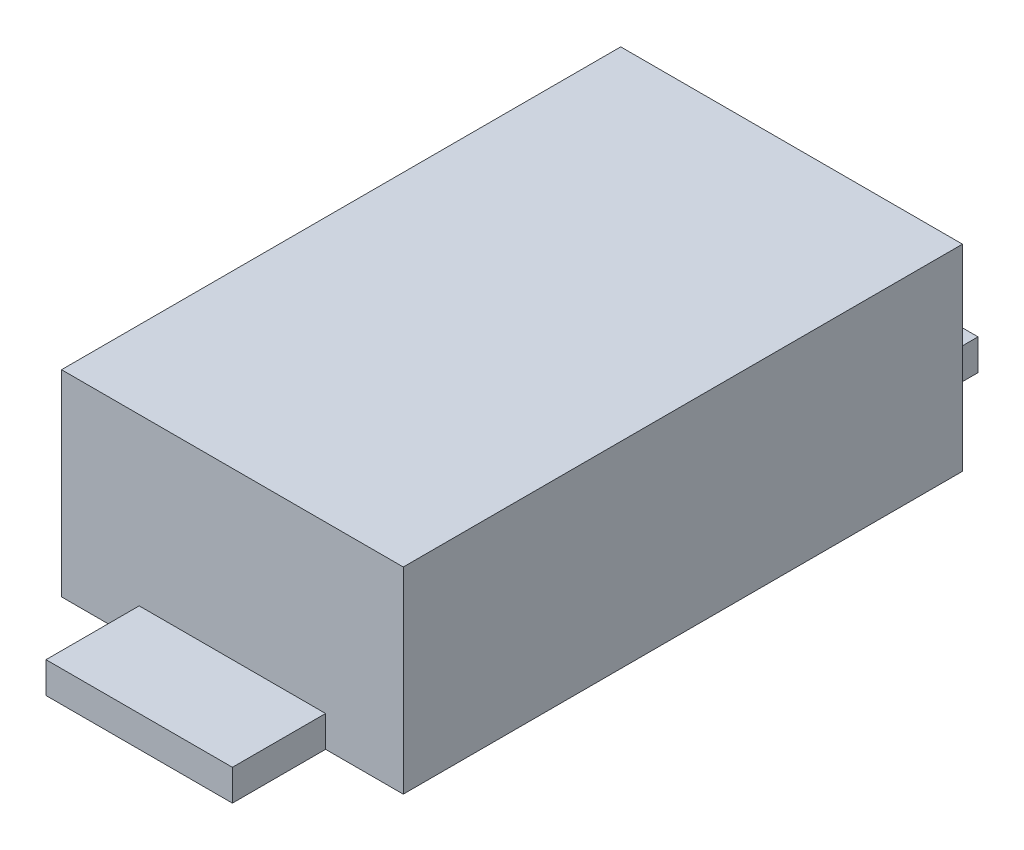
ISO-10303-21;
HEADER;
FILE_DESCRIPTION(('STEP AP214'),'2;1');
FILE_NAME('part.step','',(''),(''),'','','');
FILE_SCHEMA(('AUTOMOTIVE_DESIGN { 1 0 10303 214 1 1 1 1 }'));
ENDSEC;
DATA;
#1=APPLICATION_CONTEXT('core data for automotive mechanical design processes');
#2=APPLICATION_PROTOCOL_DEFINITION('international standard','automotive_design',2000,#1);
#3=PRODUCT_CONTEXT('',#1,'mechanical');
#4=PRODUCT('Part','Part','',(#3));
#5=PRODUCT_RELATED_PRODUCT_CATEGORY('part','',(#4));
#6=PRODUCT_DEFINITION_FORMATION('','',#4);
#7=PRODUCT_DEFINITION_CONTEXT('part definition',#1,'design');
#8=PRODUCT_DEFINITION('design','',#6,#7);
#9=PRODUCT_DEFINITION_SHAPE('','',#8);
#10=(LENGTH_UNIT() NAMED_UNIT(*) SI_UNIT(.MILLI.,.METRE.));
#11=(NAMED_UNIT(*) PLANE_ANGLE_UNIT() SI_UNIT($,.RADIAN.));
#12=(NAMED_UNIT(*) SI_UNIT($,.STERADIAN.) SOLID_ANGLE_UNIT());
#13=UNCERTAINTY_MEASURE_WITH_UNIT(LENGTH_MEASURE(1.E-05),#10,'distance_accuracy_value','');
#14=(GEOMETRIC_REPRESENTATION_CONTEXT(3) GLOBAL_UNCERTAINTY_ASSIGNED_CONTEXT((#13)) GLOBAL_UNIT_ASSIGNED_CONTEXT((#10,
#11,#12)) REPRESENTATION_CONTEXT('',''));
#15=CARTESIAN_POINT('',(0.,0.,0.));
#16=DIRECTION('',(0.,0.,1.));
#17=DIRECTION('',(1.,0.,0.));
#18=AXIS2_PLACEMENT_3D('',#15,#16,#17);
#19=CARTESIAN_POINT('',(0.,0.15,0.));
#20=DIRECTION('',(0.,-1.,0.));
#21=DIRECTION('',(0.,0.,-1.));
#22=AXIS2_PLACEMENT_3D('',#19,#20,#21);
#23=PLANE('',#22);
#24=DIRECTION('',(0.,0.,-1.));
#25=VECTOR('',#24,1.);
#26=CARTESIAN_POINT('',(-0.45,0.15,1.35));
#27=LINE('',#26,#25);
#28=CARTESIAN_POINT('',(-0.45,0.15,1.8));
#29=VERTEX_POINT('',#28);
#30=CARTESIAN_POINT('',(-0.45,0.15,1.35));
#31=VERTEX_POINT('',#30);
#32=EDGE_CURVE('E204',#29,#31,#27,.T.);
#33=ORIENTED_EDGE('',*,*,#32,.F.);
#34=DIRECTION('',(-1.,0.,0.));
#35=VECTOR('',#34,1.);
#36=CARTESIAN_POINT('',(-0.45,0.15,1.8));
#37=LINE('',#36,#35);
#38=CARTESIAN_POINT('',(0.45,0.15,1.8));
#39=VERTEX_POINT('',#38);
#40=EDGE_CURVE('E25',#39,#29,#37,.T.);
#41=ORIENTED_EDGE('',*,*,#40,.F.);
#42=DIRECTION('',(0.,0.,1.));
#43=VECTOR('',#42,1.);
#44=CARTESIAN_POINT('',(0.45,0.15,1.35));
#45=LINE('',#44,#43);
#46=CARTESIAN_POINT('',(0.45,0.15,1.35));
#47=VERTEX_POINT('',#46);
#48=EDGE_CURVE('E11',#47,#39,#45,.T.);
#49=ORIENTED_EDGE('',*,*,#48,.F.);
#50=DIRECTION('',(1.,0.,0.));
#51=VECTOR('',#50,1.);
#52=CARTESIAN_POINT('',(-0.45,0.15,1.35));
#53=LINE('',#52,#51);
#54=EDGE_CURVE('E165',#31,#47,#53,.T.);
#55=ORIENTED_EDGE('',*,*,#54,.F.);
#56=EDGE_LOOP('',(#33,#41,#49,#55));
#57=FACE_BOUND('',#56,.T.);
#58=ADVANCED_FACE('F17',(#57),#23,.F.);
#59=CARTESIAN_POINT('',(0.45,0.15,1.35));
#60=DIRECTION('',(1.,0.,0.));
#61=DIRECTION('',(0.,1.,0.));
#62=AXIS2_PLACEMENT_3D('',#59,#60,#61);
#63=PLANE('',#62);
#64=DIRECTION('',(0.,0.,1.));
#65=VECTOR('',#64,1.);
#66=CARTESIAN_POINT('',(0.45,0.,1.35));
#67=LINE('',#66,#65);
#68=CARTESIAN_POINT('',(0.45,0.,1.35));
#69=VERTEX_POINT('',#68);
#70=CARTESIAN_POINT('',(0.45,0.,1.8));
#71=VERTEX_POINT('',#70);
#72=EDGE_CURVE('E187',#69,#71,#67,.T.);
#73=ORIENTED_EDGE('',*,*,#72,.F.);
#74=DIRECTION('',(0.,-1.,0.));
#75=VECTOR('',#74,1.);
#76=CARTESIAN_POINT('',(0.45,0.15,1.35));
#77=LINE('',#76,#75);
#78=EDGE_CURVE('E160',#47,#69,#77,.T.);
#79=ORIENTED_EDGE('',*,*,#78,.F.);
#80=ORIENTED_EDGE('',*,*,#48,.T.);
#81=DIRECTION('',(0.,-1.,0.));
#82=VECTOR('',#81,1.);
#83=CARTESIAN_POINT('',(0.45,0.15,1.8));
#84=LINE('',#83,#82);
#85=EDGE_CURVE('E206',#39,#71,#84,.T.);
#86=ORIENTED_EDGE('',*,*,#85,.T.);
#87=EDGE_LOOP('',(#73,#79,#80,#86));
#88=FACE_BOUND('',#87,.T.);
#89=ADVANCED_FACE('F264',(#88),#63,.T.);
#90=CARTESIAN_POINT('',(-0.45,0.15,1.8));
#91=DIRECTION('',(0.,0.,1.));
#92=DIRECTION('',(1.,0.,0.));
#93=AXIS2_PLACEMENT_3D('',#90,#91,#92);
#94=PLANE('',#93);
#95=DIRECTION('',(-1.,0.,0.));
#96=VECTOR('',#95,1.);
#97=CARTESIAN_POINT('',(-0.45,0.,1.8));
#98=LINE('',#97,#96);
#99=CARTESIAN_POINT('',(-0.45,0.,1.8));
#100=VERTEX_POINT('',#99);
#101=EDGE_CURVE('E182',#71,#100,#98,.T.);
#102=ORIENTED_EDGE('',*,*,#101,.F.);
#103=ORIENTED_EDGE('',*,*,#85,.F.);
#104=ORIENTED_EDGE('',*,*,#40,.T.);
#105=DIRECTION('',(0.,-1.,0.));
#106=VECTOR('',#105,1.);
#107=CARTESIAN_POINT('',(-0.45,0.15,1.8));
#108=LINE('',#107,#106);
#109=EDGE_CURVE('E207',#29,#100,#108,.T.);
#110=ORIENTED_EDGE('',*,*,#109,.T.);
#111=EDGE_LOOP('',(#102,#103,#104,#110));
#112=FACE_BOUND('',#111,.T.);
#113=ADVANCED_FACE('F258',(#112),#94,.T.);
#114=CARTESIAN_POINT('',(-0.45,0.15,1.35));
#115=DIRECTION('',(-1.,0.,0.));
#116=DIRECTION('',(0.,0.,1.));
#117=AXIS2_PLACEMENT_3D('',#114,#115,#116);
#118=PLANE('',#117);
#119=DIRECTION('',(0.,0.,-1.));
#120=VECTOR('',#119,1.);
#121=CARTESIAN_POINT('',(-0.45,0.,1.35));
#122=LINE('',#121,#120);
#123=CARTESIAN_POINT('',(-0.45,0.,1.35));
#124=VERTEX_POINT('',#123);
#125=EDGE_CURVE('E186',#100,#124,#122,.T.);
#126=ORIENTED_EDGE('',*,*,#125,.F.);
#127=ORIENTED_EDGE('',*,*,#109,.F.);
#128=ORIENTED_EDGE('',*,*,#32,.T.);
#129=DIRECTION('',(0.,-1.,0.));
#130=VECTOR('',#129,1.);
#131=CARTESIAN_POINT('',(-0.45,0.15,1.35));
#132=LINE('',#131,#130);
#133=EDGE_CURVE('E491',#31,#124,#132,.T.);
#134=ORIENTED_EDGE('',*,*,#133,.T.);
#135=EDGE_LOOP('',(#126,#127,#128,#134));
#136=FACE_BOUND('',#135,.T.);
#137=ADVANCED_FACE('F263',(#136),#118,.T.);
#138=CARTESIAN_POINT('',(0.,0.15,0.));
#139=DIRECTION('',(0.,-1.,0.));
#140=DIRECTION('',(0.,0.,-1.));
#141=AXIS2_PLACEMENT_3D('',#138,#139,#140);
#142=PLANE('',#141);
#143=DIRECTION('',(0.,0.,1.));
#144=VECTOR('',#143,1.);
#145=CARTESIAN_POINT('',(-0.45,0.15,-1.35));
#146=LINE('',#145,#144);
#147=CARTESIAN_POINT('',(-0.45,0.15,-1.8));
#148=VERTEX_POINT('',#147);
#149=CARTESIAN_POINT('',(-0.45,0.15,-1.35));
#150=VERTEX_POINT('',#149);
#151=EDGE_CURVE('E235',#148,#150,#146,.T.);
#152=ORIENTED_EDGE('',*,*,#151,.T.);
#153=DIRECTION('',(1.,0.,0.));
#154=VECTOR('',#153,1.);
#155=CARTESIAN_POINT('',(-0.45,0.15,-1.35));
#156=LINE('',#155,#154);
#157=CARTESIAN_POINT('',(0.45,0.15,-1.35));
#158=VERTEX_POINT('',#157);
#159=EDGE_CURVE('E178',#150,#158,#156,.T.);
#160=ORIENTED_EDGE('',*,*,#159,.T.);
#161=DIRECTION('',(0.,0.,-1.));
#162=VECTOR('',#161,1.);
#163=CARTESIAN_POINT('',(0.45,0.15,-1.35));
#164=LINE('',#163,#162);
#165=CARTESIAN_POINT('',(0.45,0.15,-1.8));
#166=VERTEX_POINT('',#165);
#167=EDGE_CURVE('E239',#158,#166,#164,.T.);
#168=ORIENTED_EDGE('',*,*,#167,.T.);
#169=DIRECTION('',(-1.,0.,0.));
#170=VECTOR('',#169,1.);
#171=CARTESIAN_POINT('',(-0.45,0.15,-1.8));
#172=LINE('',#171,#170);
#173=EDGE_CURVE('E219',#166,#148,#172,.T.);
#174=ORIENTED_EDGE('',*,*,#173,.T.);
#175=EDGE_LOOP('',(#152,#160,#168,#174));
#176=FACE_BOUND('',#175,.T.);
#177=ADVANCED_FACE('F306',(#176),#142,.F.);
#178=CARTESIAN_POINT('',(-0.45,0.15,-1.8));
#179=DIRECTION('',(0.,0.,1.));
#180=DIRECTION('',(1.,0.,0.));
#181=AXIS2_PLACEMENT_3D('',#178,#179,#180);
#182=PLANE('',#181);
#183=DIRECTION('',(-1.,0.,0.));
#184=VECTOR('',#183,1.);
#185=CARTESIAN_POINT('',(-0.45,0.,-1.8));
#186=LINE('',#185,#184);
#187=CARTESIAN_POINT('',(0.45,0.,-1.8));
#188=VERTEX_POINT('',#187);
#189=CARTESIAN_POINT('',(-0.45,0.,-1.8));
#190=VERTEX_POINT('',#189);
#191=EDGE_CURVE('E227',#188,#190,#186,.T.);
#192=ORIENTED_EDGE('',*,*,#191,.T.);
#193=DIRECTION('',(0.,-1.,0.));
#194=VECTOR('',#193,1.);
#195=CARTESIAN_POINT('',(-0.45,0.15,-1.8));
#196=LINE('',#195,#194);
#197=EDGE_CURVE('E240',#148,#190,#196,.T.);
#198=ORIENTED_EDGE('',*,*,#197,.F.);
#199=ORIENTED_EDGE('',*,*,#173,.F.);
#200=DIRECTION('',(0.,-1.,0.));
#201=VECTOR('',#200,1.);
#202=CARTESIAN_POINT('',(0.45,0.15,-1.8));
#203=LINE('',#202,#201);
#204=EDGE_CURVE('E236',#166,#188,#203,.T.);
#205=ORIENTED_EDGE('',*,*,#204,.T.);
#206=EDGE_LOOP('',(#192,#198,#199,#205));
#207=FACE_BOUND('',#206,.T.);
#208=ADVANCED_FACE('F287',(#207),#182,.F.);
#209=CARTESIAN_POINT('',(0.45,0.15,-1.35));
#210=DIRECTION('',(-1.,0.,0.));
#211=DIRECTION('',(0.,0.,1.));
#212=AXIS2_PLACEMENT_3D('',#209,#210,#211);
#213=PLANE('',#212);
#214=DIRECTION('',(0.,0.,-1.));
#215=VECTOR('',#214,1.);
#216=CARTESIAN_POINT('',(0.45,0.,-1.35));
#217=LINE('',#216,#215);
#218=CARTESIAN_POINT('',(0.45,0.,-1.35));
#219=VERTEX_POINT('',#218);
#220=EDGE_CURVE('E231',#219,#188,#217,.T.);
#221=ORIENTED_EDGE('',*,*,#220,.T.);
#222=ORIENTED_EDGE('',*,*,#204,.F.);
#223=ORIENTED_EDGE('',*,*,#167,.F.);
#224=DIRECTION('',(0.,-1.,0.));
#225=VECTOR('',#224,1.);
#226=CARTESIAN_POINT('',(0.45,0.15,-1.35));
#227=LINE('',#226,#225);
#228=EDGE_CURVE('E174',#158,#219,#227,.T.);
#229=ORIENTED_EDGE('',*,*,#228,.T.);
#230=EDGE_LOOP('',(#221,#222,#223,#229));
#231=FACE_BOUND('',#230,.T.);
#232=ADVANCED_FACE('F281',(#231),#213,.F.);
#233=CARTESIAN_POINT('',(-0.45,0.15,-1.35));
#234=DIRECTION('',(1.,0.,0.));
#235=DIRECTION('',(0.,1.,0.));
#236=AXIS2_PLACEMENT_3D('',#233,#234,#235);
#237=PLANE('',#236);
#238=DIRECTION('',(0.,0.,1.));
#239=VECTOR('',#238,1.);
#240=CARTESIAN_POINT('',(-0.45,0.,-1.35));
#241=LINE('',#240,#239);
#242=CARTESIAN_POINT('',(-0.45,0.,-1.35));
#243=VERTEX_POINT('',#242);
#244=EDGE_CURVE('E224',#190,#243,#241,.T.);
#245=ORIENTED_EDGE('',*,*,#244,.T.);
#246=DIRECTION('',(0.,-1.,0.));
#247=VECTOR('',#246,1.);
#248=CARTESIAN_POINT('',(-0.45,0.15,-1.35));
#249=LINE('',#248,#247);
#250=EDGE_CURVE('E200',#150,#243,#249,.T.);
#251=ORIENTED_EDGE('',*,*,#250,.F.);
#252=ORIENTED_EDGE('',*,*,#151,.F.);
#253=ORIENTED_EDGE('',*,*,#197,.T.);
#254=EDGE_LOOP('',(#245,#251,#252,#253));
#255=FACE_BOUND('',#254,.T.);
#256=ADVANCED_FACE('F286',(#255),#237,.F.);
#257=CARTESIAN_POINT('',(0.,0.,0.));
#258=DIRECTION('',(0.,1.,0.));
#259=DIRECTION('',(1.,0.,0.));
#260=AXIS2_PLACEMENT_3D('',#257,#258,#259);
#261=PLANE('',#260);
#262=DIRECTION('',(0.,0.,-1.));
#263=VECTOR('',#262,1.);
#264=CARTESIAN_POINT('',(0.825,0.,-1.35));
#265=LINE('',#264,#263);
#266=CARTESIAN_POINT('',(0.825,0.,1.35));
#267=VERTEX_POINT('',#266);
#268=CARTESIAN_POINT('',(0.825,0.,-1.35));
#269=VERTEX_POINT('',#268);
#270=EDGE_CURVE('E133',#267,#269,#265,.T.);
#271=ORIENTED_EDGE('',*,*,#270,.F.);
#272=DIRECTION('',(1.,0.,0.));
#273=VECTOR('',#272,1.);
#274=CARTESIAN_POINT('',(-0.825,0.,1.35));
#275=LINE('',#274,#273);
#276=EDGE_CURVE('E138',#69,#267,#275,.T.);
#277=ORIENTED_EDGE('',*,*,#276,.F.);
#278=ORIENTED_EDGE('',*,*,#72,.T.);
#279=ORIENTED_EDGE('',*,*,#101,.T.);
#280=ORIENTED_EDGE('',*,*,#125,.T.);
#281=DIRECTION('',(1.,0.,0.));
#282=VECTOR('',#281,1.);
#283=CARTESIAN_POINT('',(-0.825,0.,1.35));
#284=LINE('',#283,#282);
#285=CARTESIAN_POINT('',(-0.825,0.,1.35));
#286=VERTEX_POINT('',#285);
#287=EDGE_CURVE('E173',#286,#124,#284,.T.);
#288=ORIENTED_EDGE('',*,*,#287,.F.);
#289=DIRECTION('',(0.,0.,1.));
#290=VECTOR('',#289,1.);
#291=CARTESIAN_POINT('',(-0.825,0.,-1.35));
#292=LINE('',#291,#290);
#293=CARTESIAN_POINT('',(-0.825,0.,-1.35));
#294=VERTEX_POINT('',#293);
#295=EDGE_CURVE('E211',#294,#286,#292,.T.);
#296=ORIENTED_EDGE('',*,*,#295,.F.);
#297=DIRECTION('',(-1.,0.,0.));
#298=VECTOR('',#297,1.);
#299=CARTESIAN_POINT('',(-0.825,0.,-1.35));
#300=LINE('',#299,#298);
#301=EDGE_CURVE('E196',#243,#294,#300,.T.);
#302=ORIENTED_EDGE('',*,*,#301,.F.);
#303=ORIENTED_EDGE('',*,*,#244,.F.);
#304=ORIENTED_EDGE('',*,*,#191,.F.);
#305=ORIENTED_EDGE('',*,*,#220,.F.);
#306=DIRECTION('',(-1.,0.,0.));
#307=VECTOR('',#306,1.);
#308=CARTESIAN_POINT('',(-0.825,0.,-1.35));
#309=LINE('',#308,#307);
#310=EDGE_CURVE('E141',#269,#219,#309,.T.);
#311=ORIENTED_EDGE('',*,*,#310,.F.);
#312=EDGE_LOOP('',(#271,#277,#278,#279,#280,#288,#296,#302,#303,#304,#305,#311));
#313=FACE_BOUND('',#312,.T.);
#314=ADVANCED_FACE('F135',(#313),#261,.F.);
#315=CARTESIAN_POINT('',(0.,0.95,0.));
#316=DIRECTION('',(0.,1.,0.));
#317=DIRECTION('',(1.,0.,0.));
#318=AXIS2_PLACEMENT_3D('',#315,#316,#317);
#319=PLANE('',#318);
#320=DIRECTION('',(0.,0.,-1.));
#321=VECTOR('',#320,1.);
#322=CARTESIAN_POINT('',(0.825,0.95,-1.35));
#323=LINE('',#322,#321);
#324=CARTESIAN_POINT('',(0.825,0.95,1.35));
#325=VERTEX_POINT('',#324);
#326=CARTESIAN_POINT('',(0.825,0.95,-1.35));
#327=VERTEX_POINT('',#326);
#328=EDGE_CURVE('E146',#325,#327,#323,.T.);
#329=ORIENTED_EDGE('',*,*,#328,.T.);
#330=DIRECTION('',(-1.,0.,0.));
#331=VECTOR('',#330,1.);
#332=CARTESIAN_POINT('',(-0.825,0.95,-1.35));
#333=LINE('',#332,#331);
#334=CARTESIAN_POINT('',(-0.825,0.95,-1.35));
#335=VERTEX_POINT('',#334);
#336=EDGE_CURVE('E188',#327,#335,#333,.T.);
#337=ORIENTED_EDGE('',*,*,#336,.T.);
#338=DIRECTION('',(0.,0.,1.));
#339=VECTOR('',#338,1.);
#340=CARTESIAN_POINT('',(-0.825,0.95,-1.35));
#341=LINE('',#340,#339);
#342=CARTESIAN_POINT('',(-0.825,0.95,1.35));
#343=VERTEX_POINT('',#342);
#344=EDGE_CURVE('E214',#335,#343,#341,.T.);
#345=ORIENTED_EDGE('',*,*,#344,.T.);
#346=DIRECTION('',(1.,0.,0.));
#347=VECTOR('',#346,1.);
#348=CARTESIAN_POINT('',(-0.825,0.95,1.35));
#349=LINE('',#348,#347);
#350=EDGE_CURVE('E155',#343,#325,#349,.T.);
#351=ORIENTED_EDGE('',*,*,#350,.T.);
#352=EDGE_LOOP('',(#329,#337,#345,#351));
#353=FACE_BOUND('',#352,.T.);
#354=ADVANCED_FACE('F338',(#353),#319,.T.);
#355=CARTESIAN_POINT('',(-0.825,0.95,-1.35));
#356=DIRECTION('',(1.,0.,0.));
#357=DIRECTION('',(0.,0.,-1.));
#358=AXIS2_PLACEMENT_3D('',#355,#356,#357);
#359=PLANE('',#358);
#360=ORIENTED_EDGE('',*,*,#295,.T.);
#361=DIRECTION('',(0.,-1.,0.));
#362=VECTOR('',#361,1.);
#363=CARTESIAN_POINT('',(-0.825,0.95,1.35));
#364=LINE('',#363,#362);
#365=EDGE_CURVE('E169',#343,#286,#364,.T.);
#366=ORIENTED_EDGE('',*,*,#365,.F.);
#367=ORIENTED_EDGE('',*,*,#344,.F.);
#368=DIRECTION('',(0.,-1.,0.));
#369=VECTOR('',#368,1.);
#370=CARTESIAN_POINT('',(-0.825,0.95,-1.35));
#371=LINE('',#370,#369);
#372=EDGE_CURVE('E193',#335,#294,#371,.T.);
#373=ORIENTED_EDGE('',*,*,#372,.T.);
#374=EDGE_LOOP('',(#360,#366,#367,#373));
#375=FACE_BOUND('',#374,.T.);
#376=ADVANCED_FACE('F322',(#375),#359,.F.);
#377=CARTESIAN_POINT('',(0.825,0.95,-1.35));
#378=DIRECTION('',(-1.,0.,0.));
#379=DIRECTION('',(0.,1.,0.));
#380=AXIS2_PLACEMENT_3D('',#377,#378,#379);
#381=PLANE('',#380);
#382=ORIENTED_EDGE('',*,*,#270,.T.);
#383=DIRECTION('',(0.,-1.,0.));
#384=VECTOR('',#383,1.);
#385=CARTESIAN_POINT('',(0.825,0.95,-1.35));
#386=LINE('',#385,#384);
#387=EDGE_CURVE('E192',#327,#269,#386,.T.);
#388=ORIENTED_EDGE('',*,*,#387,.F.);
#389=ORIENTED_EDGE('',*,*,#328,.F.);
#390=DIRECTION('',(0.,-1.,0.));
#391=VECTOR('',#390,1.);
#392=CARTESIAN_POINT('',(0.825,0.95,1.35));
#393=LINE('',#392,#391);
#394=EDGE_CURVE('E149',#325,#267,#393,.T.);
#395=ORIENTED_EDGE('',*,*,#394,.T.);
#396=EDGE_LOOP('',(#382,#388,#389,#395));
#397=FACE_BOUND('',#396,.T.);
#398=ADVANCED_FACE('F150',(#397),#381,.F.);
#399=CARTESIAN_POINT('',(-0.825,0.95,-1.35));
#400=DIRECTION('',(0.,0.,1.));
#401=DIRECTION('',(1.,0.,0.));
#402=AXIS2_PLACEMENT_3D('',#399,#400,#401);
#403=PLANE('',#402);
#404=ORIENTED_EDGE('',*,*,#228,.F.);
#405=ORIENTED_EDGE('',*,*,#159,.F.);
#406=ORIENTED_EDGE('',*,*,#250,.T.);
#407=ORIENTED_EDGE('',*,*,#301,.T.);
#408=ORIENTED_EDGE('',*,*,#372,.F.);
#409=ORIENTED_EDGE('',*,*,#336,.F.);
#410=ORIENTED_EDGE('',*,*,#387,.T.);
#411=ORIENTED_EDGE('',*,*,#310,.T.);
#412=EDGE_LOOP('',(#404,#405,#406,#407,#408,#409,#410,#411));
#413=FACE_BOUND('',#412,.T.);
#414=ADVANCED_FACE('F275',(#413),#403,.F.);
#415=CARTESIAN_POINT('',(-0.825,0.95,1.35));
#416=DIRECTION('',(0.,0.,-1.));
#417=DIRECTION('',(0.,-1.,0.));
#418=AXIS2_PLACEMENT_3D('',#415,#416,#417);
#419=PLANE('',#418);
#420=ORIENTED_EDGE('',*,*,#133,.F.);
#421=ORIENTED_EDGE('',*,*,#54,.T.);
#422=ORIENTED_EDGE('',*,*,#78,.T.);
#423=ORIENTED_EDGE('',*,*,#276,.T.);
#424=ORIENTED_EDGE('',*,*,#394,.F.);
#425=ORIENTED_EDGE('',*,*,#350,.F.);
#426=ORIENTED_EDGE('',*,*,#365,.T.);
#427=ORIENTED_EDGE('',*,*,#287,.T.);
#428=EDGE_LOOP('',(#420,#421,#422,#423,#424,#425,#426,#427));
#429=FACE_BOUND('',#428,.T.);
#430=ADVANCED_FACE('F158',(#429),#419,.F.);
#431=CLOSED_SHELL('',(#58,#89,#113,#137,#177,#208,#232,#256,#314,#354,#376,#398,#414,#430));
#432=MANIFOLD_SOLID_BREP('B1',#431);
#433=ADVANCED_BREP_SHAPE_REPRESENTATION('',(#18,#432),#14);
#434=SHAPE_DEFINITION_REPRESENTATION(#9,#433);
ENDSEC;
END-ISO-10303-21;
